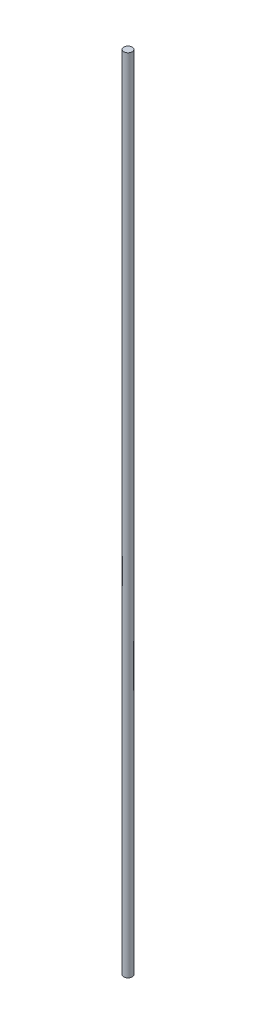
ISO-10303-21;
HEADER;
FILE_DESCRIPTION(('STEP AP214'),'2;1');
FILE_NAME('part.step','',(''),(''),'','','');
FILE_SCHEMA(('AUTOMOTIVE_DESIGN { 1 0 10303 214 1 1 1 1 }'));
ENDSEC;
DATA;
#1=APPLICATION_CONTEXT('core data for automotive mechanical design processes');
#2=APPLICATION_PROTOCOL_DEFINITION('international standard','automotive_design',2000,#1);
#3=PRODUCT_CONTEXT('',#1,'mechanical');
#4=PRODUCT('Part','Part','',(#3));
#5=PRODUCT_RELATED_PRODUCT_CATEGORY('part','',(#4));
#6=PRODUCT_DEFINITION_FORMATION('','',#4);
#7=PRODUCT_DEFINITION_CONTEXT('part definition',#1,'design');
#8=PRODUCT_DEFINITION('design','',#6,#7);
#9=PRODUCT_DEFINITION_SHAPE('','',#8);
#10=(LENGTH_UNIT() NAMED_UNIT(*) SI_UNIT(.MILLI.,.METRE.));
#11=(NAMED_UNIT(*) PLANE_ANGLE_UNIT() SI_UNIT($,.RADIAN.));
#12=(NAMED_UNIT(*) SI_UNIT($,.STERADIAN.) SOLID_ANGLE_UNIT());
#13=UNCERTAINTY_MEASURE_WITH_UNIT(LENGTH_MEASURE(1.E-05),#10,'distance_accuracy_value','');
#14=(GEOMETRIC_REPRESENTATION_CONTEXT(3) GLOBAL_UNCERTAINTY_ASSIGNED_CONTEXT((#13)) GLOBAL_UNIT_ASSIGNED_CONTEXT((#10,
#11,#12)) REPRESENTATION_CONTEXT('',''));
#15=CARTESIAN_POINT('',(0.,0.,0.));
#16=DIRECTION('',(0.,0.,1.));
#17=DIRECTION('',(1.,0.,0.));
#18=AXIS2_PLACEMENT_3D('',#15,#16,#17);
#19=CARTESIAN_POINT('',(0.,914.4,0.));
#20=DIRECTION('',(0.,-1.,0.));
#21=DIRECTION('',(0.,0.,-1.));
#22=AXIS2_PLACEMENT_3D('',#19,#20,#21);
#23=CYLINDRICAL_SURFACE('',#22,4.7625);
#24=CARTESIAN_POINT('',(0.,914.4,0.));
#25=DIRECTION('',(0.,1.,0.));
#26=DIRECTION('',(0.,0.,1.));
#27=AXIS2_PLACEMENT_3D('',#24,#25,#26);
#28=CIRCLE('',#27,4.7625);
#29=CARTESIAN_POINT('',(0.,914.4,4.7625));
#30=VERTEX_POINT('',#29);
#31=EDGE_CURVE('E10',#30,#30,#28,.T.);
#32=ORIENTED_EDGE('',*,*,#31,.F.);
#33=EDGE_LOOP('',(#32));
#34=FACE_BOUND('',#33,.T.);
#35=CARTESIAN_POINT('',(0.,0.,0.));
#36=DIRECTION('',(0.,1.,0.));
#37=DIRECTION('',(0.,0.,1.));
#38=AXIS2_PLACEMENT_3D('',#35,#36,#37);
#39=CIRCLE('',#38,4.7625);
#40=CARTESIAN_POINT('',(0.,0.,4.7625));
#41=VERTEX_POINT('',#40);
#42=EDGE_CURVE('E34',#41,#41,#39,.T.);
#43=ORIENTED_EDGE('',*,*,#42,.T.);
#44=EDGE_LOOP('',(#43));
#45=FACE_BOUND('',#44,.T.);
#46=ADVANCED_FACE('F31',(#34,#45),#23,.T.);
#47=CARTESIAN_POINT('',(0.,914.4,0.));
#48=DIRECTION('',(0.,1.,0.));
#49=DIRECTION('',(0.,0.,1.));
#50=AXIS2_PLACEMENT_3D('',#47,#48,#49);
#51=PLANE('',#50);
#52=ORIENTED_EDGE('',*,*,#31,.T.);
#53=EDGE_LOOP('',(#52));
#54=FACE_BOUND('',#53,.T.);
#55=ADVANCED_FACE('F46',(#54),#51,.T.);
#56=CARTESIAN_POINT('',(0.,0.,0.));
#57=DIRECTION('',(0.,1.,0.));
#58=DIRECTION('',(0.,0.,1.));
#59=AXIS2_PLACEMENT_3D('',#56,#57,#58);
#60=PLANE('',#59);
#61=ORIENTED_EDGE('',*,*,#42,.F.);
#62=EDGE_LOOP('',(#61));
#63=FACE_BOUND('',#62,.T.);
#64=ADVANCED_FACE('F44',(#63),#60,.F.);
#65=CLOSED_SHELL('',(#46,#55,#64));
#66=MANIFOLD_SOLID_BREP('B2',#65);
#67=ADVANCED_BREP_SHAPE_REPRESENTATION('',(#18,#66),#14);
#68=SHAPE_DEFINITION_REPRESENTATION(#9,#67);
ENDSEC;
END-ISO-10303-21;
